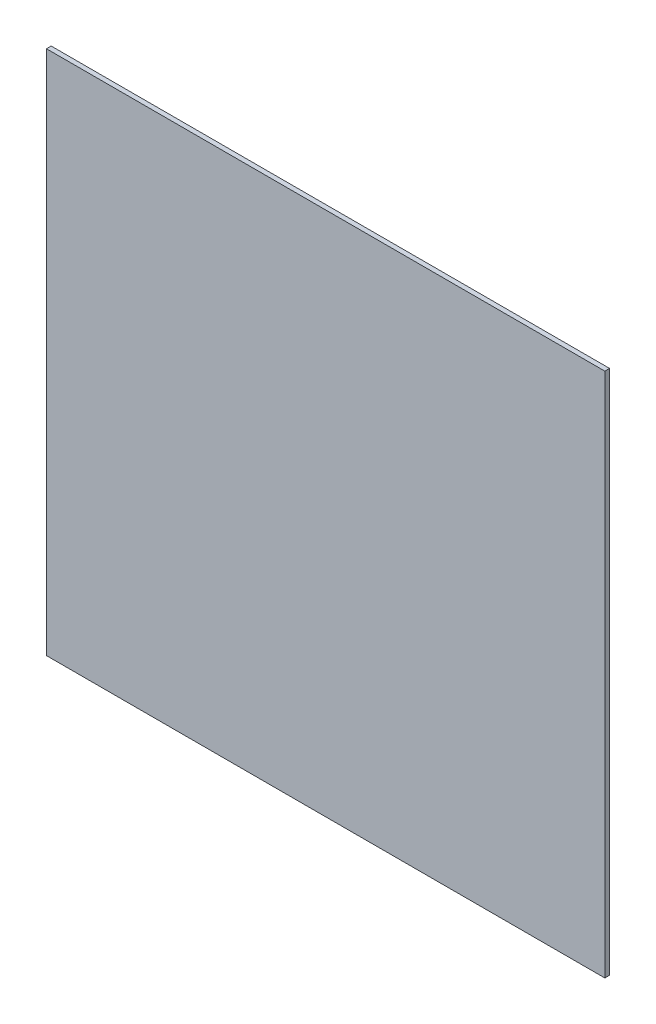
ISO-10303-21;
HEADER;
FILE_DESCRIPTION(('STEP AP214'),'2;1');
FILE_NAME('part.step','',(''),(''),'','','');
FILE_SCHEMA(('AUTOMOTIVE_DESIGN { 1 0 10303 214 1 1 1 1 }'));
ENDSEC;
DATA;
#1=APPLICATION_CONTEXT('core data for automotive mechanical design processes');
#2=APPLICATION_PROTOCOL_DEFINITION('international standard','automotive_design',2000,#1);
#3=PRODUCT_CONTEXT('',#1,'mechanical');
#4=PRODUCT('Part','Part','',(#3));
#5=PRODUCT_RELATED_PRODUCT_CATEGORY('part','',(#4));
#6=PRODUCT_DEFINITION_FORMATION('','',#4);
#7=PRODUCT_DEFINITION_CONTEXT('part definition',#1,'design');
#8=PRODUCT_DEFINITION('design','',#6,#7);
#9=PRODUCT_DEFINITION_SHAPE('','',#8);
#10=(LENGTH_UNIT() NAMED_UNIT(*) SI_UNIT(.MILLI.,.METRE.));
#11=(NAMED_UNIT(*) PLANE_ANGLE_UNIT() SI_UNIT($,.RADIAN.));
#12=(NAMED_UNIT(*) SI_UNIT($,.STERADIAN.) SOLID_ANGLE_UNIT());
#13=UNCERTAINTY_MEASURE_WITH_UNIT(LENGTH_MEASURE(1.E-05),#10,'distance_accuracy_value','');
#14=(GEOMETRIC_REPRESENTATION_CONTEXT(3) GLOBAL_UNCERTAINTY_ASSIGNED_CONTEXT((#13)) GLOBAL_UNIT_ASSIGNED_CONTEXT((#10,
#11,#12)) REPRESENTATION_CONTEXT('',''));
#15=CARTESIAN_POINT('',(0.,0.,0.));
#16=DIRECTION('',(0.,0.,1.));
#17=DIRECTION('',(1.,0.,0.));
#18=AXIS2_PLACEMENT_3D('',#15,#16,#17);
#19=CARTESIAN_POINT('',(0.,0.,1.27));
#20=DIRECTION('',(1.,0.,0.));
#21=DIRECTION('',(0.,0.,-1.));
#22=AXIS2_PLACEMENT_3D('',#19,#20,#21);
#23=PLANE('',#22);
#24=DIRECTION('',(0.,-1.,0.));
#25=VECTOR('',#24,1.);
#26=CARTESIAN_POINT('',(0.,0.,0.));
#27=LINE('',#26,#25);
#28=CARTESIAN_POINT('',(0.,141.19,0.));
#29=VERTEX_POINT('',#28);
#30=CARTESIAN_POINT('',(0.,0.,0.));
#31=VERTEX_POINT('',#30);
#32=EDGE_CURVE('E102',#29,#31,#27,.T.);
#33=ORIENTED_EDGE('',*,*,#32,.T.);
#34=DIRECTION('',(0.,0.,-1.));
#35=VECTOR('',#34,1.);
#36=CARTESIAN_POINT('',(0.,0.,1.27));
#37=LINE('',#36,#35);
#38=CARTESIAN_POINT('',(0.,0.,1.27));
#39=VERTEX_POINT('',#38);
#40=EDGE_CURVE('E11',#39,#31,#37,.T.);
#41=ORIENTED_EDGE('',*,*,#40,.F.);
#42=DIRECTION('',(0.,-1.,0.));
#43=VECTOR('',#42,1.);
#44=CARTESIAN_POINT('',(0.,0.,1.27));
#45=LINE('',#44,#43);
#46=CARTESIAN_POINT('',(0.,141.19,1.27));
#47=VERTEX_POINT('',#46);
#48=EDGE_CURVE('E90',#47,#39,#45,.T.);
#49=ORIENTED_EDGE('',*,*,#48,.F.);
#50=DIRECTION('',(0.,0.,-1.));
#51=VECTOR('',#50,1.);
#52=CARTESIAN_POINT('',(0.,141.19,1.27));
#53=LINE('',#52,#51);
#54=EDGE_CURVE('E98',#47,#29,#53,.T.);
#55=ORIENTED_EDGE('',*,*,#54,.T.);
#56=EDGE_LOOP('',(#33,#41,#49,#55));
#57=FACE_BOUND('',#56,.T.);
#58=ADVANCED_FACE('F39',(#57),#23,.F.);
#59=CARTESIAN_POINT('',(0.,0.,1.27));
#60=DIRECTION('',(0.,1.,0.));
#61=DIRECTION('',(0.,0.,1.));
#62=AXIS2_PLACEMENT_3D('',#59,#60,#61);
#63=PLANE('',#62);
#64=DIRECTION('',(1.,0.,0.));
#65=VECTOR('',#64,1.);
#66=CARTESIAN_POINT('',(0.,0.,0.));
#67=LINE('',#66,#65);
#68=CARTESIAN_POINT('',(150.,0.,0.));
#69=VERTEX_POINT('',#68);
#70=EDGE_CURVE('E94',#31,#69,#67,.T.);
#71=ORIENTED_EDGE('',*,*,#70,.T.);
#72=DIRECTION('',(0.,0.,-1.));
#73=VECTOR('',#72,1.);
#74=CARTESIAN_POINT('',(150.,0.,1.27));
#75=LINE('',#74,#73);
#76=CARTESIAN_POINT('',(150.,0.,1.27));
#77=VERTEX_POINT('',#76);
#78=EDGE_CURVE('E47',#77,#69,#75,.T.);
#79=ORIENTED_EDGE('',*,*,#78,.F.);
#80=DIRECTION('',(1.,0.,0.));
#81=VECTOR('',#80,1.);
#82=CARTESIAN_POINT('',(0.,0.,1.27));
#83=LINE('',#82,#81);
#84=EDGE_CURVE('E85',#39,#77,#83,.T.);
#85=ORIENTED_EDGE('',*,*,#84,.F.);
#86=ORIENTED_EDGE('',*,*,#40,.T.);
#87=EDGE_LOOP('',(#71,#79,#85,#86));
#88=FACE_BOUND('',#87,.T.);
#89=ADVANCED_FACE('F93',(#88),#63,.F.);
#90=CARTESIAN_POINT('',(150.,0.,1.27));
#91=DIRECTION('',(-1.,0.,0.));
#92=DIRECTION('',(0.,0.,1.));
#93=AXIS2_PLACEMENT_3D('',#90,#91,#92);
#94=PLANE('',#93);
#95=DIRECTION('',(0.,1.,0.));
#96=VECTOR('',#95,1.);
#97=CARTESIAN_POINT('',(150.,0.,0.));
#98=LINE('',#97,#96);
#99=CARTESIAN_POINT('',(150.,141.19,0.));
#100=VERTEX_POINT('',#99);
#101=EDGE_CURVE('E72',#69,#100,#98,.T.);
#102=ORIENTED_EDGE('',*,*,#101,.T.);
#103=DIRECTION('',(0.,0.,-1.));
#104=VECTOR('',#103,1.);
#105=CARTESIAN_POINT('',(150.,141.19,1.27));
#106=LINE('',#105,#104);
#107=CARTESIAN_POINT('',(150.,141.19,1.27));
#108=VERTEX_POINT('',#107);
#109=EDGE_CURVE('E95',#108,#100,#106,.T.);
#110=ORIENTED_EDGE('',*,*,#109,.F.);
#111=DIRECTION('',(0.,1.,0.));
#112=VECTOR('',#111,1.);
#113=CARTESIAN_POINT('',(150.,0.,1.27));
#114=LINE('',#113,#112);
#115=EDGE_CURVE('E88',#77,#108,#114,.T.);
#116=ORIENTED_EDGE('',*,*,#115,.F.);
#117=ORIENTED_EDGE('',*,*,#78,.T.);
#118=EDGE_LOOP('',(#102,#110,#116,#117));
#119=FACE_BOUND('',#118,.T.);
#120=ADVANCED_FACE('F96',(#119),#94,.F.);
#121=CARTESIAN_POINT('',(0.,141.19,1.27));
#122=DIRECTION('',(0.,-1.,0.));
#123=DIRECTION('',(0.,0.,-1.));
#124=AXIS2_PLACEMENT_3D('',#121,#122,#123);
#125=PLANE('',#124);
#126=DIRECTION('',(-1.,0.,0.));
#127=VECTOR('',#126,1.);
#128=CARTESIAN_POINT('',(0.,141.19,0.));
#129=LINE('',#128,#127);
#130=EDGE_CURVE('E78',#100,#29,#129,.T.);
#131=ORIENTED_EDGE('',*,*,#130,.T.);
#132=ORIENTED_EDGE('',*,*,#54,.F.);
#133=DIRECTION('',(-1.,0.,0.));
#134=VECTOR('',#133,1.);
#135=CARTESIAN_POINT('',(0.,141.19,1.27));
#136=LINE('',#135,#134);
#137=EDGE_CURVE('E55',#108,#47,#136,.T.);
#138=ORIENTED_EDGE('',*,*,#137,.F.);
#139=ORIENTED_EDGE('',*,*,#109,.T.);
#140=EDGE_LOOP('',(#131,#132,#138,#139));
#141=FACE_BOUND('',#140,.T.);
#142=ADVANCED_FACE('F109',(#141),#125,.F.);
#143=CARTESIAN_POINT('',(0.,0.,1.27));
#144=DIRECTION('',(0.,0.,-1.));
#145=DIRECTION('',(-1.,0.,0.));
#146=AXIS2_PLACEMENT_3D('',#143,#144,#145);
#147=PLANE('',#146);
#148=ORIENTED_EDGE('',*,*,#48,.T.);
#149=ORIENTED_EDGE('',*,*,#84,.T.);
#150=ORIENTED_EDGE('',*,*,#115,.T.);
#151=ORIENTED_EDGE('',*,*,#137,.T.);
#152=EDGE_LOOP('',(#148,#149,#150,#151));
#153=FACE_BOUND('',#152,.T.);
#154=ADVANCED_FACE('F86',(#153),#147,.F.);
#155=CARTESIAN_POINT('',(0.,0.,0.));
#156=DIRECTION('',(0.,0.,-1.));
#157=DIRECTION('',(-1.,0.,0.));
#158=AXIS2_PLACEMENT_3D('',#155,#156,#157);
#159=PLANE('',#158);
#160=ORIENTED_EDGE('',*,*,#32,.F.);
#161=ORIENTED_EDGE('',*,*,#130,.F.);
#162=ORIENTED_EDGE('',*,*,#101,.F.);
#163=ORIENTED_EDGE('',*,*,#70,.F.);
#164=EDGE_LOOP('',(#160,#161,#162,#163));
#165=FACE_BOUND('',#164,.T.);
#166=ADVANCED_FACE('F112',(#165),#159,.T.);
#167=CLOSED_SHELL('',(#58,#89,#120,#142,#154,#166));
#168=MANIFOLD_SOLID_BREP('B2',#167);
#169=ADVANCED_BREP_SHAPE_REPRESENTATION('',(#18,#168),#14);
#170=SHAPE_DEFINITION_REPRESENTATION(#9,#169);
ENDSEC;
END-ISO-10303-21;
